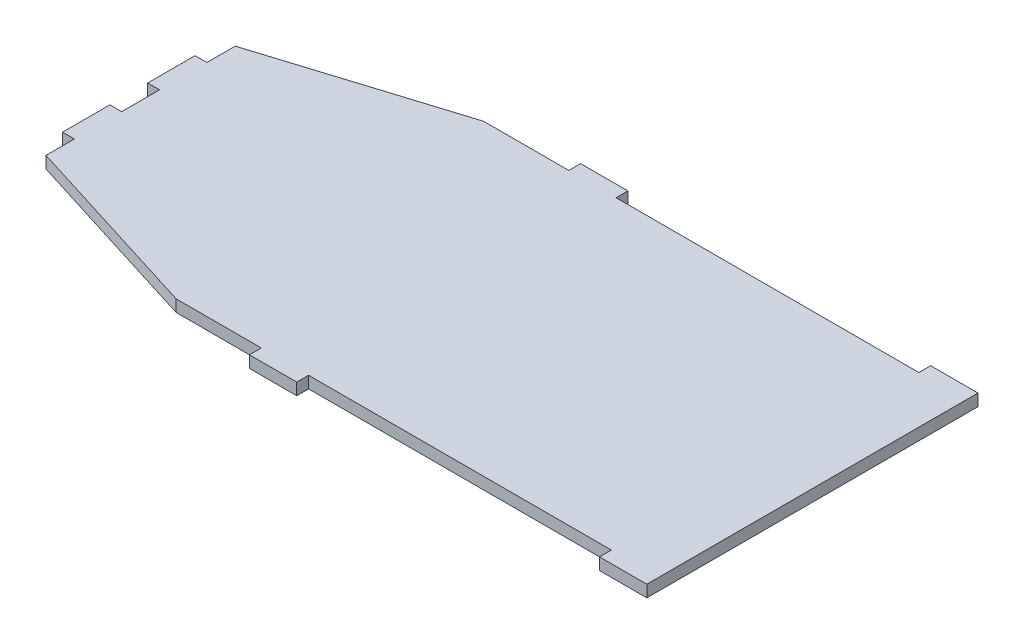
ISO-10303-21;
HEADER;
FILE_DESCRIPTION(('STEP AP214'),'2;1');
FILE_NAME('part.step','',(''),(''),'','','');
FILE_SCHEMA(('AUTOMOTIVE_DESIGN { 1 0 10303 214 1 1 1 1 }'));
ENDSEC;
DATA;
#1=APPLICATION_CONTEXT('core data for automotive mechanical design processes');
#2=APPLICATION_PROTOCOL_DEFINITION('international standard','automotive_design',2000,#1);
#3=PRODUCT_CONTEXT('',#1,'mechanical');
#4=PRODUCT('Part','Part','',(#3));
#5=PRODUCT_RELATED_PRODUCT_CATEGORY('part','',(#4));
#6=PRODUCT_DEFINITION_FORMATION('','',#4);
#7=PRODUCT_DEFINITION_CONTEXT('part definition',#1,'design');
#8=PRODUCT_DEFINITION('design','',#6,#7);
#9=PRODUCT_DEFINITION_SHAPE('','',#8);
#10=(LENGTH_UNIT() NAMED_UNIT(*) SI_UNIT(.MILLI.,.METRE.));
#11=(NAMED_UNIT(*) PLANE_ANGLE_UNIT() SI_UNIT($,.RADIAN.));
#12=(NAMED_UNIT(*) SI_UNIT($,.STERADIAN.) SOLID_ANGLE_UNIT());
#13=UNCERTAINTY_MEASURE_WITH_UNIT(LENGTH_MEASURE(1.E-05),#10,'distance_accuracy_value','');
#14=(GEOMETRIC_REPRESENTATION_CONTEXT(3) GLOBAL_UNCERTAINTY_ASSIGNED_CONTEXT((#13)) GLOBAL_UNIT_ASSIGNED_CONTEXT((#10,
#11,#12)) REPRESENTATION_CONTEXT('',''));
#15=CARTESIAN_POINT('',(0.,0.,0.));
#16=DIRECTION('',(0.,0.,1.));
#17=DIRECTION('',(1.,0.,0.));
#18=AXIS2_PLACEMENT_3D('',#15,#16,#17);
#19=CARTESIAN_POINT('',(170.815,3.175,-44.45));
#20=DIRECTION('',(0.,0.,1.));
#21=DIRECTION('',(1.,0.,0.));
#22=AXIS2_PLACEMENT_3D('',#19,#20,#21);
#23=PLANE('',#22);
#24=DIRECTION('',(-1.,0.,0.));
#25=VECTOR('',#24,1.);
#26=CARTESIAN_POINT('',(170.815,0.,-44.45));
#27=LINE('',#26,#25);
#28=CARTESIAN_POINT('',(183.515,0.,-44.45));
#29=VERTEX_POINT('',#28);
#30=CARTESIAN_POINT('',(170.815,0.,-44.45));
#31=VERTEX_POINT('',#30);
#32=EDGE_CURVE('E249',#29,#31,#27,.T.);
#33=ORIENTED_EDGE('',*,*,#32,.T.);
#34=DIRECTION('',(0.,-1.,0.));
#35=VECTOR('',#34,1.);
#36=CARTESIAN_POINT('',(170.815,3.175,-44.45));
#37=LINE('',#36,#35);
#38=CARTESIAN_POINT('',(170.815,3.175,-44.45));
#39=VERTEX_POINT('',#38);
#40=EDGE_CURVE('E11',#39,#31,#37,.T.);
#41=ORIENTED_EDGE('',*,*,#40,.F.);
#42=DIRECTION('',(-1.,0.,0.));
#43=VECTOR('',#42,1.);
#44=CARTESIAN_POINT('',(170.815,3.175,-44.45));
#45=LINE('',#44,#43);
#46=CARTESIAN_POINT('',(183.515,3.175,-44.45));
#47=VERTEX_POINT('',#46);
#48=EDGE_CURVE('E327',#47,#39,#45,.T.);
#49=ORIENTED_EDGE('',*,*,#48,.F.);
#50=DIRECTION('',(0.,-1.,0.));
#51=VECTOR('',#50,1.);
#52=CARTESIAN_POINT('',(183.515,3.175,-44.45));
#53=LINE('',#52,#51);
#54=EDGE_CURVE('E245',#47,#29,#53,.T.);
#55=ORIENTED_EDGE('',*,*,#54,.T.);
#56=EDGE_LOOP('',(#33,#41,#49,#55));
#57=FACE_BOUND('',#56,.T.);
#58=ADVANCED_FACE('F39',(#57),#23,.F.);
#59=CARTESIAN_POINT('',(170.815,3.175,-41.275));
#60=DIRECTION('',(1.,0.,0.));
#61=DIRECTION('',(0.,0.,-1.));
#62=AXIS2_PLACEMENT_3D('',#59,#60,#61);
#63=PLANE('',#62);
#64=DIRECTION('',(0.,0.,1.));
#65=VECTOR('',#64,1.);
#66=CARTESIAN_POINT('',(170.815,0.,-41.275));
#67=LINE('',#66,#65);
#68=CARTESIAN_POINT('',(170.815,0.,-41.275));
#69=VERTEX_POINT('',#68);
#70=EDGE_CURVE('E253',#31,#69,#67,.T.);
#71=ORIENTED_EDGE('',*,*,#70,.T.);
#72=DIRECTION('',(0.,-1.,0.));
#73=VECTOR('',#72,1.);
#74=CARTESIAN_POINT('',(170.815,3.175,-41.275));
#75=LINE('',#74,#73);
#76=CARTESIAN_POINT('',(170.815,3.175,-41.275));
#77=VERTEX_POINT('',#76);
#78=EDGE_CURVE('E48',#77,#69,#75,.T.);
#79=ORIENTED_EDGE('',*,*,#78,.F.);
#80=DIRECTION('',(0.,0.,1.));
#81=VECTOR('',#80,1.);
#82=CARTESIAN_POINT('',(170.815,3.175,-41.275));
#83=LINE('',#82,#81);
#84=EDGE_CURVE('E151',#39,#77,#83,.T.);
#85=ORIENTED_EDGE('',*,*,#84,.F.);
#86=ORIENTED_EDGE('',*,*,#40,.T.);
#87=EDGE_LOOP('',(#71,#79,#85,#86));
#88=FACE_BOUND('',#87,.T.);
#89=ADVANCED_FACE('F512',(#88),#63,.F.);
#90=CARTESIAN_POINT('',(89.5350000000001,3.175,-41.275));
#91=DIRECTION('',(0.,0.,1.));
#92=DIRECTION('',(1.,0.,0.));
#93=AXIS2_PLACEMENT_3D('',#90,#91,#92);
#94=PLANE('',#93);
#95=DIRECTION('',(-1.,0.,0.));
#96=VECTOR('',#95,1.);
#97=CARTESIAN_POINT('',(89.5350000000001,0.,-41.275));
#98=LINE('',#97,#96);
#99=CARTESIAN_POINT('',(89.5350000000001,0.,-41.275));
#100=VERTEX_POINT('',#99);
#101=EDGE_CURVE('E256',#69,#100,#98,.T.);
#102=ORIENTED_EDGE('',*,*,#101,.T.);
#103=DIRECTION('',(0.,-1.,0.));
#104=VECTOR('',#103,1.);
#105=CARTESIAN_POINT('',(89.5350000000001,3.175,-41.275));
#106=LINE('',#105,#104);
#107=CARTESIAN_POINT('',(89.5350000000001,3.175,-41.275));
#108=VERTEX_POINT('',#107);
#109=EDGE_CURVE('E410',#108,#100,#106,.T.);
#110=ORIENTED_EDGE('',*,*,#109,.F.);
#111=DIRECTION('',(-1.,0.,0.));
#112=VECTOR('',#111,1.);
#113=CARTESIAN_POINT('',(89.5350000000001,3.175,-41.275));
#114=LINE('',#113,#112);
#115=EDGE_CURVE('E420',#77,#108,#114,.T.);
#116=ORIENTED_EDGE('',*,*,#115,.F.);
#117=ORIENTED_EDGE('',*,*,#78,.T.);
#118=EDGE_LOOP('',(#102,#110,#116,#117));
#119=FACE_BOUND('',#118,.T.);
#120=ADVANCED_FACE('F418',(#119),#94,.F.);
#121=CARTESIAN_POINT('',(89.5350000000001,3.175,-44.45));
#122=DIRECTION('',(-1.,0.,0.));
#123=DIRECTION('',(0.,0.,1.));
#124=AXIS2_PLACEMENT_3D('',#121,#122,#123);
#125=PLANE('',#124);
#126=DIRECTION('',(0.,0.,-1.));
#127=VECTOR('',#126,1.);
#128=CARTESIAN_POINT('',(89.5350000000001,0.,-44.45));
#129=LINE('',#128,#127);
#130=CARTESIAN_POINT('',(89.5350000000001,0.,-44.45));
#131=VERTEX_POINT('',#130);
#132=EDGE_CURVE('E259',#100,#131,#129,.T.);
#133=ORIENTED_EDGE('',*,*,#132,.T.);
#134=DIRECTION('',(0.,-1.,0.));
#135=VECTOR('',#134,1.);
#136=CARTESIAN_POINT('',(89.5350000000001,3.175,-44.45));
#137=LINE('',#136,#135);
#138=CARTESIAN_POINT('',(89.5350000000001,3.175,-44.45));
#139=VERTEX_POINT('',#138);
#140=EDGE_CURVE('E406',#139,#131,#137,.T.);
#141=ORIENTED_EDGE('',*,*,#140,.F.);
#142=DIRECTION('',(0.,0.,-1.));
#143=VECTOR('',#142,1.);
#144=CARTESIAN_POINT('',(89.5350000000001,3.175,-44.45));
#145=LINE('',#144,#143);
#146=EDGE_CURVE('E437',#108,#139,#145,.T.);
#147=ORIENTED_EDGE('',*,*,#146,.F.);
#148=ORIENTED_EDGE('',*,*,#109,.T.);
#149=EDGE_LOOP('',(#133,#141,#147,#148));
#150=FACE_BOUND('',#149,.T.);
#151=ADVANCED_FACE('F427',(#150),#125,.F.);
#152=CARTESIAN_POINT('',(76.8350000000001,3.175,-44.45));
#153=DIRECTION('',(0.,0.,1.));
#154=DIRECTION('',(1.,0.,0.));
#155=AXIS2_PLACEMENT_3D('',#152,#153,#154);
#156=PLANE('',#155);
#157=DIRECTION('',(-1.,0.,0.));
#158=VECTOR('',#157,1.);
#159=CARTESIAN_POINT('',(76.8350000000001,0.,-44.45));
#160=LINE('',#159,#158);
#161=CARTESIAN_POINT('',(76.8350000000001,0.,-44.45));
#162=VERTEX_POINT('',#161);
#163=EDGE_CURVE('E262',#131,#162,#160,.T.);
#164=ORIENTED_EDGE('',*,*,#163,.T.);
#165=DIRECTION('',(0.,-1.,0.));
#166=VECTOR('',#165,1.);
#167=CARTESIAN_POINT('',(76.8350000000001,3.175,-44.45));
#168=LINE('',#167,#166);
#169=CARTESIAN_POINT('',(76.8350000000001,3.175,-44.45));
#170=VERTEX_POINT('',#169);
#171=EDGE_CURVE('E402',#170,#162,#168,.T.);
#172=ORIENTED_EDGE('',*,*,#171,.F.);
#173=DIRECTION('',(-1.,0.,0.));
#174=VECTOR('',#173,1.);
#175=CARTESIAN_POINT('',(76.8350000000001,3.175,-44.45));
#176=LINE('',#175,#174);
#177=EDGE_CURVE('E433',#139,#170,#176,.T.);
#178=ORIENTED_EDGE('',*,*,#177,.F.);
#179=ORIENTED_EDGE('',*,*,#140,.T.);
#180=EDGE_LOOP('',(#164,#172,#178,#179));
#181=FACE_BOUND('',#180,.T.);
#182=ADVANCED_FACE('F431',(#181),#156,.F.);
#183=CARTESIAN_POINT('',(76.835,3.175,-41.275));
#184=DIRECTION('',(1.,0.,0.));
#185=DIRECTION('',(0.,0.,-1.));
#186=AXIS2_PLACEMENT_3D('',#183,#184,#185);
#187=PLANE('',#186);
#188=DIRECTION('',(0.,0.,1.));
#189=VECTOR('',#188,1.);
#190=CARTESIAN_POINT('',(76.835,0.,-41.275));
#191=LINE('',#190,#189);
#192=CARTESIAN_POINT('',(76.835,0.,-41.275));
#193=VERTEX_POINT('',#192);
#194=EDGE_CURVE('E265',#162,#193,#191,.T.);
#195=ORIENTED_EDGE('',*,*,#194,.T.);
#196=DIRECTION('',(0.,-1.,0.));
#197=VECTOR('',#196,1.);
#198=CARTESIAN_POINT('',(76.835,3.175,-41.275));
#199=LINE('',#198,#197);
#200=CARTESIAN_POINT('',(76.835,3.175,-41.275));
#201=VERTEX_POINT('',#200);
#202=EDGE_CURVE('E398',#201,#193,#199,.T.);
#203=ORIENTED_EDGE('',*,*,#202,.F.);
#204=DIRECTION('',(0.,0.,1.));
#205=VECTOR('',#204,1.);
#206=CARTESIAN_POINT('',(76.835,3.175,-41.275));
#207=LINE('',#206,#205);
#208=EDGE_CURVE('E436',#170,#201,#207,.T.);
#209=ORIENTED_EDGE('',*,*,#208,.F.);
#210=ORIENTED_EDGE('',*,*,#171,.T.);
#211=EDGE_LOOP('',(#195,#203,#209,#210));
#212=FACE_BOUND('',#211,.T.);
#213=ADVANCED_FACE('F524',(#212),#187,.F.);
#214=CARTESIAN_POINT('',(53.975,3.175,-41.275));
#215=DIRECTION('',(0.,0.,1.));
#216=DIRECTION('',(1.,0.,0.));
#217=AXIS2_PLACEMENT_3D('',#214,#215,#216);
#218=PLANE('',#217);
#219=DIRECTION('',(-1.,0.,0.));
#220=VECTOR('',#219,1.);
#221=CARTESIAN_POINT('',(53.975,0.,-41.275));
#222=LINE('',#221,#220);
#223=CARTESIAN_POINT('',(53.975,0.,-41.275));
#224=VERTEX_POINT('',#223);
#225=EDGE_CURVE('E268',#193,#224,#222,.T.);
#226=ORIENTED_EDGE('',*,*,#225,.T.);
#227=DIRECTION('',(0.,-1.,0.));
#228=VECTOR('',#227,1.);
#229=CARTESIAN_POINT('',(53.975,3.175,-41.275));
#230=LINE('',#229,#228);
#231=CARTESIAN_POINT('',(53.975,3.175,-41.275));
#232=VERTEX_POINT('',#231);
#233=EDGE_CURVE('E394',#232,#224,#230,.T.);
#234=ORIENTED_EDGE('',*,*,#233,.F.);
#235=DIRECTION('',(-1.,0.,0.));
#236=VECTOR('',#235,1.);
#237=CARTESIAN_POINT('',(53.975,3.175,-41.275));
#238=LINE('',#237,#236);
#239=EDGE_CURVE('E441',#201,#232,#238,.T.);
#240=ORIENTED_EDGE('',*,*,#239,.F.);
#241=ORIENTED_EDGE('',*,*,#202,.T.);
#242=EDGE_LOOP('',(#226,#234,#240,#241));
#243=FACE_BOUND('',#242,.T.);
#244=ADVANCED_FACE('F527',(#243),#218,.F.);
#245=CARTESIAN_POINT('',(3.175,3.175,-25.4));
#246=DIRECTION('',(0.298274993135947,0.,0.95447997803503));
#247=DIRECTION('',(0.95447997803503,0.,-0.298274993135947));
#248=AXIS2_PLACEMENT_3D('',#245,#246,#247);
#249=PLANE('',#248);
#250=DIRECTION('',(-0.95447997803503,0.,0.298274993135947));
#251=VECTOR('',#250,1.);
#252=CARTESIAN_POINT('',(3.175,0.,-25.4));
#253=LINE('',#252,#251);
#254=CARTESIAN_POINT('',(3.175,0.,-25.4));
#255=VERTEX_POINT('',#254);
#256=EDGE_CURVE('E271',#224,#255,#253,.T.);
#257=ORIENTED_EDGE('',*,*,#256,.T.);
#258=DIRECTION('',(0.,-1.,0.));
#259=VECTOR('',#258,1.);
#260=CARTESIAN_POINT('',(3.175,3.175,-25.4));
#261=LINE('',#260,#259);
#262=CARTESIAN_POINT('',(3.175,3.175,-25.4));
#263=VERTEX_POINT('',#262);
#264=EDGE_CURVE('E390',#263,#255,#261,.T.);
#265=ORIENTED_EDGE('',*,*,#264,.F.);
#266=DIRECTION('',(-0.95447997803503,0.,0.298274993135947));
#267=VECTOR('',#266,1.);
#268=CARTESIAN_POINT('',(3.175,3.175,-25.4));
#269=LINE('',#268,#267);
#270=EDGE_CURVE('E448',#232,#263,#269,.T.);
#271=ORIENTED_EDGE('',*,*,#270,.F.);
#272=ORIENTED_EDGE('',*,*,#233,.T.);
#273=EDGE_LOOP('',(#257,#265,#271,#272));
#274=FACE_BOUND('',#273,.T.);
#275=ADVANCED_FACE('F531',(#274),#249,.F.);
#276=CARTESIAN_POINT('',(3.17499999999999,3.175,-17.78));
#277=DIRECTION('',(1.,0.,0.));
#278=DIRECTION('',(0.,0.,-1.));
#279=AXIS2_PLACEMENT_3D('',#276,#277,#278);
#280=PLANE('',#279);
#281=DIRECTION('',(0.,0.,1.));
#282=VECTOR('',#281,1.);
#283=CARTESIAN_POINT('',(3.17499999999999,0.,-17.78));
#284=LINE('',#283,#282);
#285=CARTESIAN_POINT('',(3.17499999999999,0.,-17.78));
#286=VERTEX_POINT('',#285);
#287=EDGE_CURVE('E274',#255,#286,#284,.T.);
#288=ORIENTED_EDGE('',*,*,#287,.T.);
#289=DIRECTION('',(0.,-1.,0.));
#290=VECTOR('',#289,1.);
#291=CARTESIAN_POINT('',(3.17499999999999,3.175,-17.78));
#292=LINE('',#291,#290);
#293=CARTESIAN_POINT('',(3.17499999999999,3.175,-17.78));
#294=VERTEX_POINT('',#293);
#295=EDGE_CURVE('E386',#294,#286,#292,.T.);
#296=ORIENTED_EDGE('',*,*,#295,.F.);
#297=DIRECTION('',(0.,0.,1.));
#298=VECTOR('',#297,1.);
#299=CARTESIAN_POINT('',(3.17499999999999,3.175,-17.78));
#300=LINE('',#299,#298);
#301=EDGE_CURVE('E451',#263,#294,#300,.T.);
#302=ORIENTED_EDGE('',*,*,#301,.F.);
#303=ORIENTED_EDGE('',*,*,#264,.T.);
#304=EDGE_LOOP('',(#288,#296,#302,#303));
#305=FACE_BOUND('',#304,.T.);
#306=ADVANCED_FACE('F535',(#305),#280,.F.);
#307=CARTESIAN_POINT('',(3.17499999999999,3.175,-17.78));
#308=DIRECTION('',(0.,0.,1.));
#309=DIRECTION('',(1.,0.,0.));
#310=AXIS2_PLACEMENT_3D('',#307,#308,#309);
#311=PLANE('',#310);
#312=DIRECTION('',(-1.,0.,0.));
#313=VECTOR('',#312,1.);
#314=CARTESIAN_POINT('',(3.17499999999999,0.,-17.78));
#315=LINE('',#314,#313);
#316=CARTESIAN_POINT('',(0.,0.,-17.78));
#317=VERTEX_POINT('',#316);
#318=EDGE_CURVE('E277',#286,#317,#315,.T.);
#319=ORIENTED_EDGE('',*,*,#318,.T.);
#320=DIRECTION('',(0.,-1.,0.));
#321=VECTOR('',#320,1.);
#322=CARTESIAN_POINT('',(0.,3.175,-17.78));
#323=LINE('',#322,#321);
#324=CARTESIAN_POINT('',(0.,3.175,-17.78));
#325=VERTEX_POINT('',#324);
#326=EDGE_CURVE('E382',#325,#317,#323,.T.);
#327=ORIENTED_EDGE('',*,*,#326,.F.);
#328=DIRECTION('',(-1.,0.,0.));
#329=VECTOR('',#328,1.);
#330=CARTESIAN_POINT('',(3.17499999999999,3.175,-17.78));
#331=LINE('',#330,#329);
#332=EDGE_CURVE('E454',#294,#325,#331,.T.);
#333=ORIENTED_EDGE('',*,*,#332,.F.);
#334=ORIENTED_EDGE('',*,*,#295,.T.);
#335=EDGE_LOOP('',(#319,#327,#333,#334));
#336=FACE_BOUND('',#335,.T.);
#337=ADVANCED_FACE('F539',(#336),#311,.F.);
#338=CARTESIAN_POINT('',(0.,3.175,-17.78));
#339=DIRECTION('',(1.,0.,0.));
#340=DIRECTION('',(0.,0.,-1.));
#341=AXIS2_PLACEMENT_3D('',#338,#339,#340);
#342=PLANE('',#341);
#343=DIRECTION('',(0.,0.,1.));
#344=VECTOR('',#343,1.);
#345=CARTESIAN_POINT('',(0.,0.,-17.78));
#346=LINE('',#345,#344);
#347=CARTESIAN_POINT('',(0.,0.,-5.08));
#348=VERTEX_POINT('',#347);
#349=EDGE_CURVE('E280',#317,#348,#346,.T.);
#350=ORIENTED_EDGE('',*,*,#349,.T.);
#351=DIRECTION('',(0.,-1.,0.));
#352=VECTOR('',#351,1.);
#353=CARTESIAN_POINT('',(0.,3.175,-5.08));
#354=LINE('',#353,#352);
#355=CARTESIAN_POINT('',(0.,3.175,-5.08));
#356=VERTEX_POINT('',#355);
#357=EDGE_CURVE('E378',#356,#348,#354,.T.);
#358=ORIENTED_EDGE('',*,*,#357,.F.);
#359=DIRECTION('',(0.,0.,1.));
#360=VECTOR('',#359,1.);
#361=CARTESIAN_POINT('',(0.,3.175,-17.78));
#362=LINE('',#361,#360);
#363=EDGE_CURVE('E457',#325,#356,#362,.T.);
#364=ORIENTED_EDGE('',*,*,#363,.F.);
#365=ORIENTED_EDGE('',*,*,#326,.T.);
#366=EDGE_LOOP('',(#350,#358,#364,#365));
#367=FACE_BOUND('',#366,.T.);
#368=ADVANCED_FACE('F543',(#367),#342,.F.);
#369=CARTESIAN_POINT('',(0.,3.175,-5.08));
#370=DIRECTION('',(0.,0.,-1.));
#371=DIRECTION('',(-1.,0.,0.));
#372=AXIS2_PLACEMENT_3D('',#369,#370,#371);
#373=PLANE('',#372);
#374=DIRECTION('',(1.,0.,0.));
#375=VECTOR('',#374,1.);
#376=CARTESIAN_POINT('',(0.,0.,-5.08));
#377=LINE('',#376,#375);
#378=CARTESIAN_POINT('',(3.17499999999998,0.,-5.08));
#379=VERTEX_POINT('',#378);
#380=EDGE_CURVE('E283',#348,#379,#377,.T.);
#381=ORIENTED_EDGE('',*,*,#380,.T.);
#382=DIRECTION('',(0.,-1.,0.));
#383=VECTOR('',#382,1.);
#384=CARTESIAN_POINT('',(3.17499999999998,3.175,-5.08));
#385=LINE('',#384,#383);
#386=CARTESIAN_POINT('',(3.17499999999998,3.175,-5.08));
#387=VERTEX_POINT('',#386);
#388=EDGE_CURVE('E374',#387,#379,#385,.T.);
#389=ORIENTED_EDGE('',*,*,#388,.F.);
#390=DIRECTION('',(1.,0.,0.));
#391=VECTOR('',#390,1.);
#392=CARTESIAN_POINT('',(0.,3.175,-5.08));
#393=LINE('',#392,#391);
#394=EDGE_CURVE('E460',#356,#387,#393,.T.);
#395=ORIENTED_EDGE('',*,*,#394,.F.);
#396=ORIENTED_EDGE('',*,*,#357,.T.);
#397=EDGE_LOOP('',(#381,#389,#395,#396));
#398=FACE_BOUND('',#397,.T.);
#399=ADVANCED_FACE('F547',(#398),#373,.F.);
#400=CARTESIAN_POINT('',(3.17499999999997,3.175,0.));
#401=DIRECTION('',(1.,0.,0.));
#402=DIRECTION('',(0.,0.,-1.));
#403=AXIS2_PLACEMENT_3D('',#400,#401,#402);
#404=PLANE('',#403);
#405=DIRECTION('',(0.,0.,1.));
#406=VECTOR('',#405,1.);
#407=CARTESIAN_POINT('',(3.17499999999997,0.,0.));
#408=LINE('',#407,#406);
#409=CARTESIAN_POINT('',(3.17499999999998,0.,5.08));
#410=VERTEX_POINT('',#409);
#411=EDGE_CURVE('E287',#379,#410,#408,.T.);
#412=ORIENTED_EDGE('',*,*,#411,.T.);
#413=DIRECTION('',(0.,-1.,0.));
#414=VECTOR('',#413,1.);
#415=CARTESIAN_POINT('',(3.17499999999998,3.175,5.08));
#416=LINE('',#415,#414);
#417=CARTESIAN_POINT('',(3.17499999999998,3.175,5.08));
#418=VERTEX_POINT('',#417);
#419=EDGE_CURVE('E370',#418,#410,#416,.T.);
#420=ORIENTED_EDGE('',*,*,#419,.F.);
#421=DIRECTION('',(0.,0.,1.));
#422=VECTOR('',#421,1.);
#423=CARTESIAN_POINT('',(3.17499999999997,3.175,0.));
#424=LINE('',#423,#422);
#425=EDGE_CURVE('E463',#387,#418,#424,.T.);
#426=ORIENTED_EDGE('',*,*,#425,.F.);
#427=ORIENTED_EDGE('',*,*,#388,.T.);
#428=EDGE_LOOP('',(#412,#420,#426,#427));
#429=FACE_BOUND('',#428,.T.);
#430=ADVANCED_FACE('F551',(#429),#404,.F.);
#431=CARTESIAN_POINT('',(0.,3.175,5.08));
#432=DIRECTION('',(0.,0.,1.));
#433=DIRECTION('',(1.,0.,0.));
#434=AXIS2_PLACEMENT_3D('',#431,#432,#433);
#435=PLANE('',#434);
#436=DIRECTION('',(-1.,0.,0.));
#437=VECTOR('',#436,1.);
#438=CARTESIAN_POINT('',(0.,0.,5.08));
#439=LINE('',#438,#437);
#440=CARTESIAN_POINT('',(0.,0.,5.08));
#441=VERTEX_POINT('',#440);
#442=EDGE_CURVE('E290',#410,#441,#439,.T.);
#443=ORIENTED_EDGE('',*,*,#442,.T.);
#444=DIRECTION('',(0.,-1.,0.));
#445=VECTOR('',#444,1.);
#446=CARTESIAN_POINT('',(0.,3.175,5.08));
#447=LINE('',#446,#445);
#448=CARTESIAN_POINT('',(0.,3.175,5.08));
#449=VERTEX_POINT('',#448);
#450=EDGE_CURVE('E366',#449,#441,#447,.T.);
#451=ORIENTED_EDGE('',*,*,#450,.F.);
#452=DIRECTION('',(-1.,0.,0.));
#453=VECTOR('',#452,1.);
#454=CARTESIAN_POINT('',(0.,3.175,5.08));
#455=LINE('',#454,#453);
#456=EDGE_CURVE('E466',#418,#449,#455,.T.);
#457=ORIENTED_EDGE('',*,*,#456,.F.);
#458=ORIENTED_EDGE('',*,*,#419,.T.);
#459=EDGE_LOOP('',(#443,#451,#457,#458));
#460=FACE_BOUND('',#459,.T.);
#461=ADVANCED_FACE('F555',(#460),#435,.F.);
#462=CARTESIAN_POINT('',(0.,3.175,17.78));
#463=DIRECTION('',(1.,0.,0.));
#464=DIRECTION('',(0.,0.,-1.));
#465=AXIS2_PLACEMENT_3D('',#462,#463,#464);
#466=PLANE('',#465);
#467=DIRECTION('',(0.,0.,1.));
#468=VECTOR('',#467,1.);
#469=CARTESIAN_POINT('',(0.,0.,17.78));
#470=LINE('',#469,#468);
#471=CARTESIAN_POINT('',(0.,0.,17.78));
#472=VERTEX_POINT('',#471);
#473=EDGE_CURVE('E293',#441,#472,#470,.T.);
#474=ORIENTED_EDGE('',*,*,#473,.T.);
#475=DIRECTION('',(0.,-1.,0.));
#476=VECTOR('',#475,1.);
#477=CARTESIAN_POINT('',(0.,3.175,17.78));
#478=LINE('',#477,#476);
#479=CARTESIAN_POINT('',(0.,3.175,17.78));
#480=VERTEX_POINT('',#479);
#481=EDGE_CURVE('E362',#480,#472,#478,.T.);
#482=ORIENTED_EDGE('',*,*,#481,.F.);
#483=DIRECTION('',(0.,0.,1.));
#484=VECTOR('',#483,1.);
#485=CARTESIAN_POINT('',(0.,3.175,17.78));
#486=LINE('',#485,#484);
#487=EDGE_CURVE('E469',#449,#480,#486,.T.);
#488=ORIENTED_EDGE('',*,*,#487,.F.);
#489=ORIENTED_EDGE('',*,*,#450,.T.);
#490=EDGE_LOOP('',(#474,#482,#488,#489));
#491=FACE_BOUND('',#490,.T.);
#492=ADVANCED_FACE('F559',(#491),#466,.F.);
#493=CARTESIAN_POINT('',(3.17499999999999,3.175,17.78));
#494=DIRECTION('',(0.,0.,-1.));
#495=DIRECTION('',(-1.,0.,0.));
#496=AXIS2_PLACEMENT_3D('',#493,#494,#495);
#497=PLANE('',#496);
#498=DIRECTION('',(1.,0.,0.));
#499=VECTOR('',#498,1.);
#500=CARTESIAN_POINT('',(3.17499999999999,0.,17.78));
#501=LINE('',#500,#499);
#502=CARTESIAN_POINT('',(3.17499999999999,0.,17.78));
#503=VERTEX_POINT('',#502);
#504=EDGE_CURVE('E296',#472,#503,#501,.T.);
#505=ORIENTED_EDGE('',*,*,#504,.T.);
#506=DIRECTION('',(0.,-1.,0.));
#507=VECTOR('',#506,1.);
#508=CARTESIAN_POINT('',(3.17499999999999,3.175,17.78));
#509=LINE('',#508,#507);
#510=CARTESIAN_POINT('',(3.17499999999999,3.175,17.78));
#511=VERTEX_POINT('',#510);
#512=EDGE_CURVE('E358',#511,#503,#509,.T.);
#513=ORIENTED_EDGE('',*,*,#512,.F.);
#514=DIRECTION('',(1.,0.,0.));
#515=VECTOR('',#514,1.);
#516=CARTESIAN_POINT('',(3.17499999999999,3.175,17.78));
#517=LINE('',#516,#515);
#518=EDGE_CURVE('E472',#480,#511,#517,.T.);
#519=ORIENTED_EDGE('',*,*,#518,.F.);
#520=ORIENTED_EDGE('',*,*,#481,.T.);
#521=EDGE_LOOP('',(#505,#513,#519,#520));
#522=FACE_BOUND('',#521,.T.);
#523=ADVANCED_FACE('F563',(#522),#497,.F.);
#524=CARTESIAN_POINT('',(3.17499999999999,3.175,17.78));
#525=DIRECTION('',(1.,0.,0.));
#526=DIRECTION('',(0.,0.,-1.));
#527=AXIS2_PLACEMENT_3D('',#524,#525,#526);
#528=PLANE('',#527);
#529=DIRECTION('',(0.,0.,1.));
#530=VECTOR('',#529,1.);
#531=CARTESIAN_POINT('',(3.17499999999999,0.,17.78));
#532=LINE('',#531,#530);
#533=CARTESIAN_POINT('',(3.17499999999999,0.,25.4));
#534=VERTEX_POINT('',#533);
#535=EDGE_CURVE('E299',#503,#534,#532,.T.);
#536=ORIENTED_EDGE('',*,*,#535,.T.);
#537=DIRECTION('',(0.,-1.,0.));
#538=VECTOR('',#537,1.);
#539=CARTESIAN_POINT('',(3.17499999999999,3.175,25.4));
#540=LINE('',#539,#538);
#541=CARTESIAN_POINT('',(3.17499999999999,3.175,25.4));
#542=VERTEX_POINT('',#541);
#543=EDGE_CURVE('E354',#542,#534,#540,.T.);
#544=ORIENTED_EDGE('',*,*,#543,.F.);
#545=DIRECTION('',(0.,0.,1.));
#546=VECTOR('',#545,1.);
#547=CARTESIAN_POINT('',(3.17499999999999,3.175,17.78));
#548=LINE('',#547,#546);
#549=EDGE_CURVE('E475',#511,#542,#548,.T.);
#550=ORIENTED_EDGE('',*,*,#549,.F.);
#551=ORIENTED_EDGE('',*,*,#512,.T.);
#552=EDGE_LOOP('',(#536,#544,#550,#551));
#553=FACE_BOUND('',#552,.T.);
#554=ADVANCED_FACE('F567',(#553),#528,.F.);
#555=CARTESIAN_POINT('',(3.17499999999999,3.175,25.4));
#556=DIRECTION('',(0.298274993135946,0.,-0.95447997803503));
#557=DIRECTION('',(-0.95447997803503,0.,-0.298274993135947));
#558=AXIS2_PLACEMENT_3D('',#555,#556,#557);
#559=PLANE('',#558);
#560=DIRECTION('',(0.95447997803503,0.,0.298274993135947));
#561=VECTOR('',#560,1.);
#562=CARTESIAN_POINT('',(3.17499999999999,0.,25.4));
#563=LINE('',#562,#561);
#564=CARTESIAN_POINT('',(53.975,0.,41.275));
#565=VERTEX_POINT('',#564);
#566=EDGE_CURVE('E302',#534,#565,#563,.T.);
#567=ORIENTED_EDGE('',*,*,#566,.T.);
#568=DIRECTION('',(0.,-1.,0.));
#569=VECTOR('',#568,1.);
#570=CARTESIAN_POINT('',(53.975,3.175,41.275));
#571=LINE('',#570,#569);
#572=CARTESIAN_POINT('',(53.975,3.175,41.275));
#573=VERTEX_POINT('',#572);
#574=EDGE_CURVE('E350',#573,#565,#571,.T.);
#575=ORIENTED_EDGE('',*,*,#574,.F.);
#576=DIRECTION('',(0.95447997803503,0.,0.298274993135947));
#577=VECTOR('',#576,1.);
#578=CARTESIAN_POINT('',(3.17499999999999,3.175,25.4));
#579=LINE('',#578,#577);
#580=EDGE_CURVE('E478',#542,#573,#579,.T.);
#581=ORIENTED_EDGE('',*,*,#580,.F.);
#582=ORIENTED_EDGE('',*,*,#543,.T.);
#583=EDGE_LOOP('',(#567,#575,#581,#582));
#584=FACE_BOUND('',#583,.T.);
#585=ADVANCED_FACE('F571',(#584),#559,.F.);
#586=CARTESIAN_POINT('',(53.975,3.175,41.275));
#587=DIRECTION('',(0.,0.,-1.));
#588=DIRECTION('',(-1.,0.,0.));
#589=AXIS2_PLACEMENT_3D('',#586,#587,#588);
#590=PLANE('',#589);
#591=DIRECTION('',(1.,0.,0.));
#592=VECTOR('',#591,1.);
#593=CARTESIAN_POINT('',(53.975,0.,41.275));
#594=LINE('',#593,#592);
#595=CARTESIAN_POINT('',(76.835,0.,41.275));
#596=VERTEX_POINT('',#595);
#597=EDGE_CURVE('E305',#565,#596,#594,.T.);
#598=ORIENTED_EDGE('',*,*,#597,.T.);
#599=DIRECTION('',(0.,-1.,0.));
#600=VECTOR('',#599,1.);
#601=CARTESIAN_POINT('',(76.835,3.175,41.275));
#602=LINE('',#601,#600);
#603=CARTESIAN_POINT('',(76.835,3.175,41.275));
#604=VERTEX_POINT('',#603);
#605=EDGE_CURVE('E346',#604,#596,#602,.T.);
#606=ORIENTED_EDGE('',*,*,#605,.F.);
#607=DIRECTION('',(1.,0.,0.));
#608=VECTOR('',#607,1.);
#609=CARTESIAN_POINT('',(53.975,3.175,41.275));
#610=LINE('',#609,#608);
#611=EDGE_CURVE('E481',#573,#604,#610,.T.);
#612=ORIENTED_EDGE('',*,*,#611,.F.);
#613=ORIENTED_EDGE('',*,*,#574,.T.);
#614=EDGE_LOOP('',(#598,#606,#612,#613));
#615=FACE_BOUND('',#614,.T.);
#616=ADVANCED_FACE('F575',(#615),#590,.F.);
#617=CARTESIAN_POINT('',(76.835,3.175,41.275));
#618=DIRECTION('',(1.,0.,0.));
#619=DIRECTION('',(0.,0.,-1.));
#620=AXIS2_PLACEMENT_3D('',#617,#618,#619);
#621=PLANE('',#620);
#622=DIRECTION('',(0.,0.,1.));
#623=VECTOR('',#622,1.);
#624=CARTESIAN_POINT('',(76.835,0.,41.275));
#625=LINE('',#624,#623);
#626=CARTESIAN_POINT('',(76.8350000000001,0.,44.45));
#627=VERTEX_POINT('',#626);
#628=EDGE_CURVE('E308',#596,#627,#625,.T.);
#629=ORIENTED_EDGE('',*,*,#628,.T.);
#630=DIRECTION('',(0.,-1.,0.));
#631=VECTOR('',#630,1.);
#632=CARTESIAN_POINT('',(76.8350000000001,3.175,44.45));
#633=LINE('',#632,#631);
#634=CARTESIAN_POINT('',(76.8350000000001,3.175,44.45));
#635=VERTEX_POINT('',#634);
#636=EDGE_CURVE('E342',#635,#627,#633,.T.);
#637=ORIENTED_EDGE('',*,*,#636,.F.);
#638=DIRECTION('',(0.,0.,1.));
#639=VECTOR('',#638,1.);
#640=CARTESIAN_POINT('',(76.835,3.175,41.275));
#641=LINE('',#640,#639);
#642=EDGE_CURVE('E484',#604,#635,#641,.T.);
#643=ORIENTED_EDGE('',*,*,#642,.F.);
#644=ORIENTED_EDGE('',*,*,#605,.T.);
#645=EDGE_LOOP('',(#629,#637,#643,#644));
#646=FACE_BOUND('',#645,.T.);
#647=ADVANCED_FACE('F579',(#646),#621,.F.);
#648=CARTESIAN_POINT('',(76.8350000000001,3.175,44.45));
#649=DIRECTION('',(0.,0.,-1.));
#650=DIRECTION('',(-1.,0.,0.));
#651=AXIS2_PLACEMENT_3D('',#648,#649,#650);
#652=PLANE('',#651);
#653=DIRECTION('',(1.,0.,0.));
#654=VECTOR('',#653,1.);
#655=CARTESIAN_POINT('',(76.8350000000001,0.,44.45));
#656=LINE('',#655,#654);
#657=CARTESIAN_POINT('',(89.5350000000001,0.,44.45));
#658=VERTEX_POINT('',#657);
#659=EDGE_CURVE('E311',#627,#658,#656,.T.);
#660=ORIENTED_EDGE('',*,*,#659,.T.);
#661=DIRECTION('',(0.,-1.,0.));
#662=VECTOR('',#661,1.);
#663=CARTESIAN_POINT('',(89.5350000000001,3.175,44.45));
#664=LINE('',#663,#662);
#665=CARTESIAN_POINT('',(89.5350000000001,3.175,44.45));
#666=VERTEX_POINT('',#665);
#667=EDGE_CURVE('E338',#666,#658,#664,.T.);
#668=ORIENTED_EDGE('',*,*,#667,.F.);
#669=DIRECTION('',(1.,0.,0.));
#670=VECTOR('',#669,1.);
#671=CARTESIAN_POINT('',(76.8350000000001,3.175,44.45));
#672=LINE('',#671,#670);
#673=EDGE_CURVE('E487',#635,#666,#672,.T.);
#674=ORIENTED_EDGE('',*,*,#673,.F.);
#675=ORIENTED_EDGE('',*,*,#636,.T.);
#676=EDGE_LOOP('',(#660,#668,#674,#675));
#677=FACE_BOUND('',#676,.T.);
#678=ADVANCED_FACE('F583',(#677),#652,.F.);
#679=CARTESIAN_POINT('',(89.5350000000001,3.175,44.45));
#680=DIRECTION('',(-1.,0.,0.));
#681=DIRECTION('',(0.,0.,1.));
#682=AXIS2_PLACEMENT_3D('',#679,#680,#681);
#683=PLANE('',#682);
#684=DIRECTION('',(0.,0.,-1.));
#685=VECTOR('',#684,1.);
#686=CARTESIAN_POINT('',(89.5350000000001,0.,44.45));
#687=LINE('',#686,#685);
#688=CARTESIAN_POINT('',(89.5350000000001,0.,41.275));
#689=VERTEX_POINT('',#688);
#690=EDGE_CURVE('E314',#658,#689,#687,.T.);
#691=ORIENTED_EDGE('',*,*,#690,.T.);
#692=DIRECTION('',(0.,-1.,0.));
#693=VECTOR('',#692,1.);
#694=CARTESIAN_POINT('',(89.5350000000001,3.175,41.275));
#695=LINE('',#694,#693);
#696=CARTESIAN_POINT('',(89.5350000000001,3.175,41.275));
#697=VERTEX_POINT('',#696);
#698=EDGE_CURVE('E334',#697,#689,#695,.T.);
#699=ORIENTED_EDGE('',*,*,#698,.F.);
#700=DIRECTION('',(0.,0.,-1.));
#701=VECTOR('',#700,1.);
#702=CARTESIAN_POINT('',(89.5350000000001,3.175,44.45));
#703=LINE('',#702,#701);
#704=EDGE_CURVE('E490',#666,#697,#703,.T.);
#705=ORIENTED_EDGE('',*,*,#704,.F.);
#706=ORIENTED_EDGE('',*,*,#667,.T.);
#707=EDGE_LOOP('',(#691,#699,#705,#706));
#708=FACE_BOUND('',#707,.T.);
#709=ADVANCED_FACE('F498',(#708),#683,.F.);
#710=CARTESIAN_POINT('',(89.5350000000001,3.175,41.275));
#711=DIRECTION('',(0.,0.,-1.));
#712=DIRECTION('',(-1.,0.,0.));
#713=AXIS2_PLACEMENT_3D('',#710,#711,#712);
#714=PLANE('',#713);
#715=DIRECTION('',(1.,0.,0.));
#716=VECTOR('',#715,1.);
#717=CARTESIAN_POINT('',(89.5350000000001,0.,41.275));
#718=LINE('',#717,#716);
#719=CARTESIAN_POINT('',(170.815,0.,41.275));
#720=VERTEX_POINT('',#719);
#721=EDGE_CURVE('E317',#689,#720,#718,.T.);
#722=ORIENTED_EDGE('',*,*,#721,.T.);
#723=DIRECTION('',(0.,-1.,0.));
#724=VECTOR('',#723,1.);
#725=CARTESIAN_POINT('',(170.815,3.175,41.275));
#726=LINE('',#725,#724);
#727=CARTESIAN_POINT('',(170.815,3.175,41.275));
#728=VERTEX_POINT('',#727);
#729=EDGE_CURVE('E238',#728,#720,#726,.T.);
#730=ORIENTED_EDGE('',*,*,#729,.F.);
#731=DIRECTION('',(1.,0.,0.));
#732=VECTOR('',#731,1.);
#733=CARTESIAN_POINT('',(89.5350000000001,3.175,41.275));
#734=LINE('',#733,#732);
#735=EDGE_CURVE('E225',#697,#728,#734,.T.);
#736=ORIENTED_EDGE('',*,*,#735,.F.);
#737=ORIENTED_EDGE('',*,*,#698,.T.);
#738=EDGE_LOOP('',(#722,#730,#736,#737));
#739=FACE_BOUND('',#738,.T.);
#740=ADVANCED_FACE('F502',(#739),#714,.F.);
#741=CARTESIAN_POINT('',(170.815,3.175,41.275));
#742=DIRECTION('',(1.,0.,0.));
#743=DIRECTION('',(0.,0.,-1.));
#744=AXIS2_PLACEMENT_3D('',#741,#742,#743);
#745=PLANE('',#744);
#746=DIRECTION('',(0.,0.,1.));
#747=VECTOR('',#746,1.);
#748=CARTESIAN_POINT('',(170.815,0.,41.275));
#749=LINE('',#748,#747);
#750=CARTESIAN_POINT('',(170.815,0.,44.45));
#751=VERTEX_POINT('',#750);
#752=EDGE_CURVE('E235',#720,#751,#749,.T.);
#753=ORIENTED_EDGE('',*,*,#752,.T.);
#754=DIRECTION('',(0.,-1.,0.));
#755=VECTOR('',#754,1.);
#756=CARTESIAN_POINT('',(170.815,3.175,44.45));
#757=LINE('',#756,#755);
#758=CARTESIAN_POINT('',(170.815,3.175,44.45));
#759=VERTEX_POINT('',#758);
#760=EDGE_CURVE('E232',#759,#751,#757,.T.);
#761=ORIENTED_EDGE('',*,*,#760,.F.);
#762=DIRECTION('',(0.,0.,1.));
#763=VECTOR('',#762,1.);
#764=CARTESIAN_POINT('',(170.815,3.175,41.275));
#765=LINE('',#764,#763);
#766=EDGE_CURVE('E218',#728,#759,#765,.T.);
#767=ORIENTED_EDGE('',*,*,#766,.F.);
#768=ORIENTED_EDGE('',*,*,#729,.T.);
#769=EDGE_LOOP('',(#753,#761,#767,#768));
#770=FACE_BOUND('',#769,.T.);
#771=ADVANCED_FACE('F233',(#770),#745,.F.);
#772=CARTESIAN_POINT('',(170.815,3.175,44.45));
#773=DIRECTION('',(0.,0.,-1.));
#774=DIRECTION('',(-1.,0.,0.));
#775=AXIS2_PLACEMENT_3D('',#772,#773,#774);
#776=PLANE('',#775);
#777=DIRECTION('',(1.,0.,0.));
#778=VECTOR('',#777,1.);
#779=CARTESIAN_POINT('',(170.815,0.,44.45));
#780=LINE('',#779,#778);
#781=CARTESIAN_POINT('',(183.515,0.,44.45));
#782=VERTEX_POINT('',#781);
#783=EDGE_CURVE('E322',#751,#782,#780,.T.);
#784=ORIENTED_EDGE('',*,*,#783,.T.);
#785=DIRECTION('',(0.,-1.,0.));
#786=VECTOR('',#785,1.);
#787=CARTESIAN_POINT('',(183.515,3.175,44.45));
#788=LINE('',#787,#786);
#789=CARTESIAN_POINT('',(183.515,3.175,44.45));
#790=VERTEX_POINT('',#789);
#791=EDGE_CURVE('E239',#790,#782,#788,.T.);
#792=ORIENTED_EDGE('',*,*,#791,.F.);
#793=DIRECTION('',(1.,0.,0.));
#794=VECTOR('',#793,1.);
#795=CARTESIAN_POINT('',(170.815,3.175,44.45));
#796=LINE('',#795,#794);
#797=EDGE_CURVE('E222',#759,#790,#796,.T.);
#798=ORIENTED_EDGE('',*,*,#797,.F.);
#799=ORIENTED_EDGE('',*,*,#760,.T.);
#800=EDGE_LOOP('',(#784,#792,#798,#799));
#801=FACE_BOUND('',#800,.T.);
#802=ADVANCED_FACE('F241',(#801),#776,.F.);
#803=CARTESIAN_POINT('',(183.515,3.175,-44.45));
#804=DIRECTION('',(-1.,0.,0.));
#805=DIRECTION('',(0.,0.,1.));
#806=AXIS2_PLACEMENT_3D('',#803,#804,#805);
#807=PLANE('',#806);
#808=DIRECTION('',(0.,0.,-1.));
#809=VECTOR('',#808,1.);
#810=CARTESIAN_POINT('',(183.515,0.,-44.45));
#811=LINE('',#810,#809);
#812=EDGE_CURVE('E139',#782,#29,#811,.T.);
#813=ORIENTED_EDGE('',*,*,#812,.T.);
#814=ORIENTED_EDGE('',*,*,#54,.F.);
#815=DIRECTION('',(0.,0.,-1.));
#816=VECTOR('',#815,1.);
#817=CARTESIAN_POINT('',(183.515,3.175,44.45));
#818=LINE('',#817,#816);
#819=EDGE_CURVE('E56',#790,#47,#818,.T.);
#820=ORIENTED_EDGE('',*,*,#819,.F.);
#821=ORIENTED_EDGE('',*,*,#791,.T.);
#822=EDGE_LOOP('',(#813,#814,#820,#821));
#823=FACE_BOUND('',#822,.T.);
#824=ADVANCED_FACE('F503',(#823),#807,.F.);
#825=CARTESIAN_POINT('',(0.,3.175,0.));
#826=DIRECTION('',(0.,-1.,0.));
#827=DIRECTION('',(0.,0.,-1.));
#828=AXIS2_PLACEMENT_3D('',#825,#826,#827);
#829=PLANE('',#828);
#830=ORIENTED_EDGE('',*,*,#48,.T.);
#831=ORIENTED_EDGE('',*,*,#84,.T.);
#832=ORIENTED_EDGE('',*,*,#115,.T.);
#833=ORIENTED_EDGE('',*,*,#146,.T.);
#834=ORIENTED_EDGE('',*,*,#177,.T.);
#835=ORIENTED_EDGE('',*,*,#208,.T.);
#836=ORIENTED_EDGE('',*,*,#239,.T.);
#837=ORIENTED_EDGE('',*,*,#270,.T.);
#838=ORIENTED_EDGE('',*,*,#301,.T.);
#839=ORIENTED_EDGE('',*,*,#332,.T.);
#840=ORIENTED_EDGE('',*,*,#363,.T.);
#841=ORIENTED_EDGE('',*,*,#394,.T.);
#842=ORIENTED_EDGE('',*,*,#425,.T.);
#843=ORIENTED_EDGE('',*,*,#456,.T.);
#844=ORIENTED_EDGE('',*,*,#487,.T.);
#845=ORIENTED_EDGE('',*,*,#518,.T.);
#846=ORIENTED_EDGE('',*,*,#549,.T.);
#847=ORIENTED_EDGE('',*,*,#580,.T.);
#848=ORIENTED_EDGE('',*,*,#611,.T.);
#849=ORIENTED_EDGE('',*,*,#642,.T.);
#850=ORIENTED_EDGE('',*,*,#673,.T.);
#851=ORIENTED_EDGE('',*,*,#704,.T.);
#852=ORIENTED_EDGE('',*,*,#735,.T.);
#853=ORIENTED_EDGE('',*,*,#766,.T.);
#854=ORIENTED_EDGE('',*,*,#797,.T.);
#855=ORIENTED_EDGE('',*,*,#819,.T.);
#856=EDGE_LOOP('',(#830,#831,#832,#833,#834,#835,#836,#837,#838,#839,#840,#841,#842,#843,#844,
#845,#846,#847,#848,#849,#850,#851,#852,#853,#854,#855));
#857=FACE_BOUND('',#856,.T.);
#858=ADVANCED_FACE('F220',(#857),#829,.F.);
#859=CARTESIAN_POINT('',(0.,0.,0.));
#860=DIRECTION('',(0.,-1.,0.));
#861=DIRECTION('',(0.,0.,-1.));
#862=AXIS2_PLACEMENT_3D('',#859,#860,#861);
#863=PLANE('',#862);
#864=ORIENTED_EDGE('',*,*,#32,.F.);
#865=ORIENTED_EDGE('',*,*,#812,.F.);
#866=ORIENTED_EDGE('',*,*,#783,.F.);
#867=ORIENTED_EDGE('',*,*,#752,.F.);
#868=ORIENTED_EDGE('',*,*,#721,.F.);
#869=ORIENTED_EDGE('',*,*,#690,.F.);
#870=ORIENTED_EDGE('',*,*,#659,.F.);
#871=ORIENTED_EDGE('',*,*,#628,.F.);
#872=ORIENTED_EDGE('',*,*,#597,.F.);
#873=ORIENTED_EDGE('',*,*,#566,.F.);
#874=ORIENTED_EDGE('',*,*,#535,.F.);
#875=ORIENTED_EDGE('',*,*,#504,.F.);
#876=ORIENTED_EDGE('',*,*,#473,.F.);
#877=ORIENTED_EDGE('',*,*,#442,.F.);
#878=ORIENTED_EDGE('',*,*,#411,.F.);
#879=ORIENTED_EDGE('',*,*,#380,.F.);
#880=ORIENTED_EDGE('',*,*,#349,.F.);
#881=ORIENTED_EDGE('',*,*,#318,.F.);
#882=ORIENTED_EDGE('',*,*,#287,.F.);
#883=ORIENTED_EDGE('',*,*,#256,.F.);
#884=ORIENTED_EDGE('',*,*,#225,.F.);
#885=ORIENTED_EDGE('',*,*,#194,.F.);
#886=ORIENTED_EDGE('',*,*,#163,.F.);
#887=ORIENTED_EDGE('',*,*,#132,.F.);
#888=ORIENTED_EDGE('',*,*,#101,.F.);
#889=ORIENTED_EDGE('',*,*,#70,.F.);
#890=EDGE_LOOP('',(#864,#865,#866,#867,#868,#869,#870,#871,#872,#873,#874,#875,#876,#877,#878,
#879,#880,#881,#882,#883,#884,#885,#886,#887,#888,#889));
#891=FACE_BOUND('',#890,.T.);
#892=ADVANCED_FACE('F422',(#891),#863,.T.);
#893=CLOSED_SHELL('',(#58,#89,#120,#151,#182,#213,#244,#275,#306,#337,#368,#399,#430,#461,#492,
#523,#554,#585,#616,#647,#678,#709,#740,#771,#802,#824,#858,#892));
#894=MANIFOLD_SOLID_BREP('B2',#893);
#895=ADVANCED_BREP_SHAPE_REPRESENTATION('',(#18,#894),#14);
#896=SHAPE_DEFINITION_REPRESENTATION(#9,#895);
ENDSEC;
END-ISO-10303-21;
